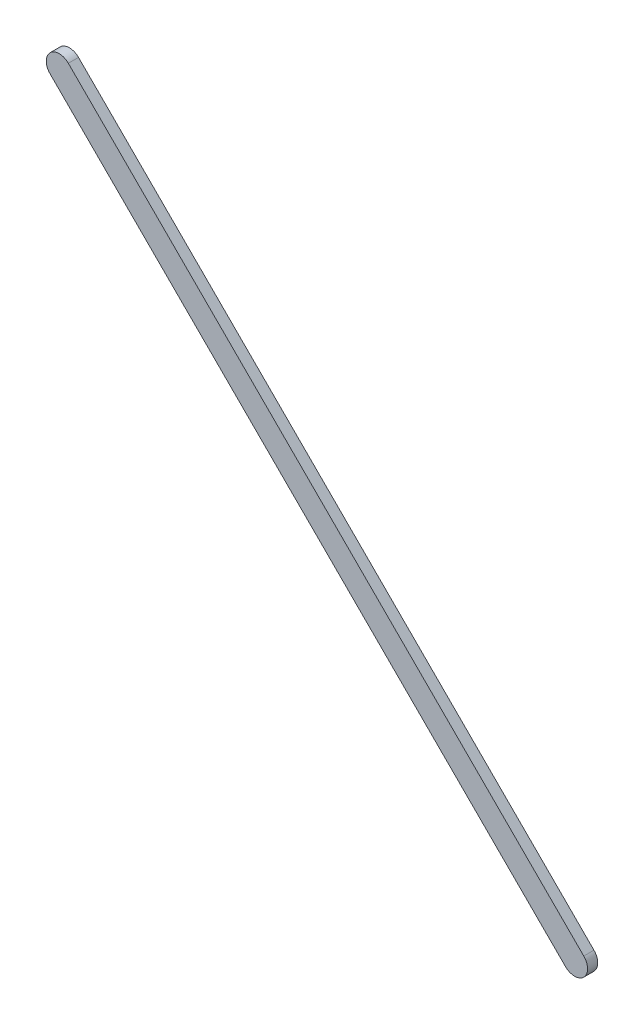
ISO-10303-21;
HEADER;
FILE_DESCRIPTION(('STEP AP214'),'2;1');
FILE_NAME('part.step','',(''),(''),'','','');
FILE_SCHEMA(('AUTOMOTIVE_DESIGN { 1 0 10303 214 1 1 1 1 }'));
ENDSEC;
DATA;
#1=APPLICATION_CONTEXT('core data for automotive mechanical design processes');
#2=APPLICATION_PROTOCOL_DEFINITION('international standard','automotive_design',2000,#1);
#3=PRODUCT_CONTEXT('',#1,'mechanical');
#4=PRODUCT('Part','Part','',(#3));
#5=PRODUCT_RELATED_PRODUCT_CATEGORY('part','',(#4));
#6=PRODUCT_DEFINITION_FORMATION('','',#4);
#7=PRODUCT_DEFINITION_CONTEXT('part definition',#1,'design');
#8=PRODUCT_DEFINITION('design','',#6,#7);
#9=PRODUCT_DEFINITION_SHAPE('','',#8);
#10=(LENGTH_UNIT() NAMED_UNIT(*) SI_UNIT(.MILLI.,.METRE.));
#11=(NAMED_UNIT(*) PLANE_ANGLE_UNIT() SI_UNIT($,.RADIAN.));
#12=(NAMED_UNIT(*) SI_UNIT($,.STERADIAN.) SOLID_ANGLE_UNIT());
#13=UNCERTAINTY_MEASURE_WITH_UNIT(LENGTH_MEASURE(1.E-05),#10,'distance_accuracy_value','');
#14=(GEOMETRIC_REPRESENTATION_CONTEXT(3) GLOBAL_UNCERTAINTY_ASSIGNED_CONTEXT((#13)) GLOBAL_UNIT_ASSIGNED_CONTEXT((#10,
#11,#12)) REPRESENTATION_CONTEXT('',''));
#15=CARTESIAN_POINT('',(0.,0.,0.));
#16=DIRECTION('',(0.,0.,1.));
#17=DIRECTION('',(1.,0.,0.));
#18=AXIS2_PLACEMENT_3D('',#15,#16,#17);
#19=CARTESIAN_POINT('',(119.17499406,68.88299406,0.));
#20=DIRECTION('',(0.707106781186548,0.707106781186548,0.));
#21=DIRECTION('',(0.707106781186548,-0.707106781186548,0.));
#22=AXIS2_PLACEMENT_3D('',#19,#20,#21);
#23=PLANE('',#22);
#24=DIRECTION('',(0.707106781186548,-0.707106781186548,0.));
#25=VECTOR('',#24,1.);
#26=CARTESIAN_POINT('',(119.17499406,68.88299406,0.1999996));
#27=LINE('',#26,#25);
#28=CARTESIAN_POINT('',(119.17499406,68.88299406,0.1999996));
#29=VERTEX_POINT('',#28);
#30=CARTESIAN_POINT('',(129.30959406,58.74839406,0.1999996));
#31=VERTEX_POINT('',#30);
#32=EDGE_CURVE('E11',#29,#31,#27,.T.);
#33=ORIENTED_EDGE('',*,*,#32,.F.);
#34=DIRECTION('',(0.,0.,1.));
#35=VECTOR('',#34,1.);
#36=CARTESIAN_POINT('',(119.17499406,68.88299406,0.));
#37=LINE('',#36,#35);
#38=CARTESIAN_POINT('',(119.17499406,68.88299406,0.));
#39=VERTEX_POINT('',#38);
#40=EDGE_CURVE('E24',#39,#29,#37,.T.);
#41=ORIENTED_EDGE('',*,*,#40,.F.);
#42=DIRECTION('',(0.707106781186548,-0.707106781186548,0.));
#43=VECTOR('',#42,1.);
#44=CARTESIAN_POINT('',(119.17499406,68.88299406,0.));
#45=LINE('',#44,#43);
#46=CARTESIAN_POINT('',(129.30959406,58.74839406,0.));
#47=VERTEX_POINT('',#46);
#48=EDGE_CURVE('E75',#39,#47,#45,.T.);
#49=ORIENTED_EDGE('',*,*,#48,.T.);
#50=DIRECTION('',(0.,0.,1.));
#51=VECTOR('',#50,1.);
#52=CARTESIAN_POINT('',(129.30959406,58.74839406,0.));
#53=LINE('',#52,#51);
#54=EDGE_CURVE('E37',#47,#31,#53,.T.);
#55=ORIENTED_EDGE('',*,*,#54,.T.);
#56=EDGE_LOOP('',(#33,#41,#49,#55));
#57=FACE_BOUND('',#56,.T.);
#58=ADVANCED_FACE('F17',(#57),#23,.F.);
#59=CARTESIAN_POINT('',(129.4892,58.928,0.));
#60=DIRECTION('',(0.,0.,-1.));
#61=DIRECTION('',(-0.70710678118652,-0.707106781186576,0.));
#62=AXIS2_PLACEMENT_3D('',#59,#60,#61);
#63=CYLINDRICAL_SURFACE('',#62,0.254001156230776);
#64=CARTESIAN_POINT('',(129.4892,58.928,0.1999996));
#65=DIRECTION('',(0.,0.,1.));
#66=DIRECTION('',(-0.70710678118652,-0.707106781186576,0.));
#67=AXIS2_PLACEMENT_3D('',#64,#65,#66);
#68=CIRCLE('',#67,0.254001156230776);
#69=CARTESIAN_POINT('',(129.66880594,59.10760594,0.1999996));
#70=VERTEX_POINT('',#69);
#71=EDGE_CURVE('E83',#31,#70,#68,.T.);
#72=ORIENTED_EDGE('',*,*,#71,.F.);
#73=ORIENTED_EDGE('',*,*,#54,.F.);
#74=CARTESIAN_POINT('',(129.4892,58.928,0.));
#75=DIRECTION('',(0.,0.,1.));
#76=DIRECTION('',(-0.70710678118652,-0.707106781186576,0.));
#77=AXIS2_PLACEMENT_3D('',#74,#75,#76);
#78=CIRCLE('',#77,0.254001156230776);
#79=CARTESIAN_POINT('',(129.66880594,59.10760594,0.));
#80=VERTEX_POINT('',#79);
#81=EDGE_CURVE('E81',#47,#80,#78,.T.);
#82=ORIENTED_EDGE('',*,*,#81,.T.);
#83=DIRECTION('',(0.,0.,1.));
#84=VECTOR('',#83,1.);
#85=CARTESIAN_POINT('',(129.66880594,59.10760594,0.));
#86=LINE('',#85,#84);
#87=EDGE_CURVE('E67',#80,#70,#86,.T.);
#88=ORIENTED_EDGE('',*,*,#87,.T.);
#89=EDGE_LOOP('',(#72,#73,#82,#88));
#90=FACE_BOUND('',#89,.T.);
#91=ADVANCED_FACE('F89',(#90),#63,.T.);
#92=CARTESIAN_POINT('',(129.66880594,59.10760594,0.));
#93=DIRECTION('',(-0.707106781186547,-0.707106781186548,0.));
#94=DIRECTION('',(-0.707106781186548,0.707106781186547,0.));
#95=AXIS2_PLACEMENT_3D('',#92,#93,#94);
#96=PLANE('',#95);
#97=DIRECTION('',(-0.707106781186548,0.707106781186547,0.));
#98=VECTOR('',#97,1.);
#99=CARTESIAN_POINT('',(129.66880594,59.10760594,0.1999996));
#100=LINE('',#99,#98);
#101=CARTESIAN_POINT('',(119.53420594,69.24220594,0.1999996));
#102=VERTEX_POINT('',#101);
#103=EDGE_CURVE('E71',#70,#102,#100,.T.);
#104=ORIENTED_EDGE('',*,*,#103,.F.);
#105=ORIENTED_EDGE('',*,*,#87,.F.);
#106=DIRECTION('',(-0.707106781186548,0.707106781186547,0.));
#107=VECTOR('',#106,1.);
#108=CARTESIAN_POINT('',(129.66880594,59.10760594,0.));
#109=LINE('',#108,#107);
#110=CARTESIAN_POINT('',(119.53420594,69.24220594,0.));
#111=VERTEX_POINT('',#110);
#112=EDGE_CURVE('E63',#80,#111,#109,.T.);
#113=ORIENTED_EDGE('',*,*,#112,.T.);
#114=DIRECTION('',(0.,0.,1.));
#115=VECTOR('',#114,1.);
#116=CARTESIAN_POINT('',(119.53420594,69.24220594,0.));
#117=LINE('',#116,#115);
#118=EDGE_CURVE('E53',#111,#102,#117,.T.);
#119=ORIENTED_EDGE('',*,*,#118,.T.);
#120=EDGE_LOOP('',(#104,#105,#113,#119));
#121=FACE_BOUND('',#120,.T.);
#122=ADVANCED_FACE('F66',(#121),#96,.F.);
#123=CARTESIAN_POINT('',(119.3546,69.0626,0.));
#124=DIRECTION('',(0.,0.,-1.));
#125=DIRECTION('',(0.707106781186548,0.707106781186548,0.));
#126=AXIS2_PLACEMENT_3D('',#123,#124,#125);
#127=CYLINDRICAL_SURFACE('',#126,0.254001156230771);
#128=CARTESIAN_POINT('',(119.3546,69.0626,0.1999996));
#129=DIRECTION('',(0.,0.,1.));
#130=DIRECTION('',(0.707106781186548,0.707106781186548,0.));
#131=AXIS2_PLACEMENT_3D('',#128,#129,#130);
#132=CIRCLE('',#131,0.254001156230771);
#133=EDGE_CURVE('E59',#102,#29,#132,.T.);
#134=ORIENTED_EDGE('',*,*,#133,.F.);
#135=ORIENTED_EDGE('',*,*,#118,.F.);
#136=CARTESIAN_POINT('',(119.3546,69.0626,0.));
#137=DIRECTION('',(0.,0.,1.));
#138=DIRECTION('',(0.707106781186548,0.707106781186548,0.));
#139=AXIS2_PLACEMENT_3D('',#136,#137,#138);
#140=CIRCLE('',#139,0.254001156230771);
#141=EDGE_CURVE('E57',#111,#39,#140,.T.);
#142=ORIENTED_EDGE('',*,*,#141,.T.);
#143=ORIENTED_EDGE('',*,*,#40,.T.);
#144=EDGE_LOOP('',(#134,#135,#142,#143));
#145=FACE_BOUND('',#144,.T.);
#146=ADVANCED_FACE('F55',(#145),#127,.T.);
#147=CARTESIAN_POINT('',(119.17499406,68.88299406,0.));
#148=DIRECTION('',(0.,0.,-1.));
#149=DIRECTION('',(-1.,0.,0.));
#150=AXIS2_PLACEMENT_3D('',#147,#148,#149);
#151=PLANE('',#150);
#152=ORIENTED_EDGE('',*,*,#141,.F.);
#153=ORIENTED_EDGE('',*,*,#112,.F.);
#154=ORIENTED_EDGE('',*,*,#81,.F.);
#155=ORIENTED_EDGE('',*,*,#48,.F.);
#156=EDGE_LOOP('',(#152,#153,#154,#155));
#157=FACE_BOUND('',#156,.T.);
#158=ADVANCED_FACE('F74',(#157),#151,.T.);
#159=CARTESIAN_POINT('',(119.17499406,68.88299406,0.1999996));
#160=DIRECTION('',(0.,0.,-1.));
#161=DIRECTION('',(-1.,0.,0.));
#162=AXIS2_PLACEMENT_3D('',#159,#160,#161);
#163=PLANE('',#162);
#164=ORIENTED_EDGE('',*,*,#32,.T.);
#165=ORIENTED_EDGE('',*,*,#71,.T.);
#166=ORIENTED_EDGE('',*,*,#103,.T.);
#167=ORIENTED_EDGE('',*,*,#133,.T.);
#168=EDGE_LOOP('',(#164,#165,#166,#167));
#169=FACE_BOUND('',#168,.T.);
#170=ADVANCED_FACE('F91',(#169),#163,.F.);
#171=CLOSED_SHELL('',(#58,#91,#122,#146,#158,#170));
#172=MANIFOLD_SOLID_BREP('B1',#171);
#173=ADVANCED_BREP_SHAPE_REPRESENTATION('',(#18,#172),#14);
#174=SHAPE_DEFINITION_REPRESENTATION(#9,#173);
ENDSEC;
END-ISO-10303-21;
